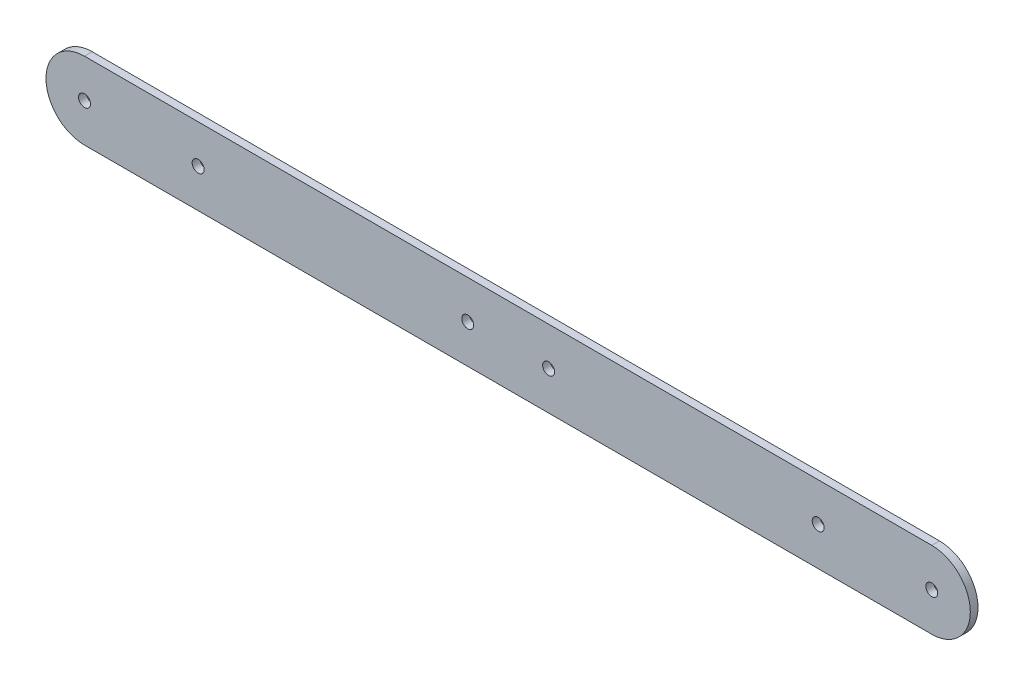
ISO-10303-21;
HEADER;
FILE_DESCRIPTION(('STEP AP214'),'2;1');
FILE_NAME('part.step','',(''),(''),'','','');
FILE_SCHEMA(('AUTOMOTIVE_DESIGN { 1 0 10303 214 1 1 1 1 }'));
ENDSEC;
DATA;
#1=APPLICATION_CONTEXT('core data for automotive mechanical design processes');
#2=APPLICATION_PROTOCOL_DEFINITION('international standard','automotive_design',2000,#1);
#3=PRODUCT_CONTEXT('',#1,'mechanical');
#4=PRODUCT('Part','Part','',(#3));
#5=PRODUCT_RELATED_PRODUCT_CATEGORY('part','',(#4));
#6=PRODUCT_DEFINITION_FORMATION('','',#4);
#7=PRODUCT_DEFINITION_CONTEXT('part definition',#1,'design');
#8=PRODUCT_DEFINITION('design','',#6,#7);
#9=PRODUCT_DEFINITION_SHAPE('','',#8);
#10=(LENGTH_UNIT() NAMED_UNIT(*) SI_UNIT(.MILLI.,.METRE.));
#11=(NAMED_UNIT(*) PLANE_ANGLE_UNIT() SI_UNIT($,.RADIAN.));
#12=(NAMED_UNIT(*) SI_UNIT($,.STERADIAN.) SOLID_ANGLE_UNIT());
#13=UNCERTAINTY_MEASURE_WITH_UNIT(LENGTH_MEASURE(1.E-05),#10,'distance_accuracy_value','');
#14=(GEOMETRIC_REPRESENTATION_CONTEXT(3) GLOBAL_UNCERTAINTY_ASSIGNED_CONTEXT((#13)) GLOBAL_UNIT_ASSIGNED_CONTEXT((#10,
#11,#12)) REPRESENTATION_CONTEXT('',''));
#15=CARTESIAN_POINT('',(0.,0.,0.));
#16=DIRECTION('',(0.,0.,1.));
#17=DIRECTION('',(1.,0.,0.));
#18=AXIS2_PLACEMENT_3D('',#15,#16,#17);
#19=CARTESIAN_POINT('',(-110.,0.,2.));
#20=DIRECTION('',(0.,0.,1.));
#21=DIRECTION('',(1.,0.,0.));
#22=AXIS2_PLACEMENT_3D('',#19,#20,#21);
#23=PLANE('',#22);
#24=CARTESIAN_POINT('',(-110.,0.,2.));
#25=DIRECTION('',(0.,0.,1.));
#26=DIRECTION('',(1.,0.,0.));
#27=AXIS2_PLACEMENT_3D('',#24,#25,#26);
#28=CIRCLE('',#27,1.54999999999999);
#29=CARTESIAN_POINT('',(-108.45,0.,2.));
#30=VERTEX_POINT('',#29);
#31=EDGE_CURVE('E160',#30,#30,#28,.T.);
#32=ORIENTED_EDGE('',*,*,#31,.F.);
#33=EDGE_LOOP('',(#32));
#34=FACE_BOUND('',#33,.T.);
#35=CARTESIAN_POINT('',(-80.5,0.,2.));
#36=DIRECTION('',(0.,0.,1.));
#37=DIRECTION('',(-1.,0.,0.));
#38=AXIS2_PLACEMENT_3D('',#35,#36,#37);
#39=CIRCLE('',#38,1.54999999999999);
#40=CARTESIAN_POINT('',(-82.05,0.,2.));
#41=VERTEX_POINT('',#40);
#42=EDGE_CURVE('E144',#41,#41,#39,.T.);
#43=ORIENTED_EDGE('',*,*,#42,.F.);
#44=EDGE_LOOP('',(#43));
#45=FACE_BOUND('',#44,.T.);
#46=CARTESIAN_POINT('',(10.5,0.,2.));
#47=DIRECTION('',(0.,0.,1.));
#48=DIRECTION('',(1.,0.,0.));
#49=AXIS2_PLACEMENT_3D('',#46,#47,#48);
#50=CIRCLE('',#49,1.55);
#51=CARTESIAN_POINT('',(12.05,0.,2.));
#52=VERTEX_POINT('',#51);
#53=EDGE_CURVE('E114',#52,#52,#50,.T.);
#54=ORIENTED_EDGE('',*,*,#53,.F.);
#55=EDGE_LOOP('',(#54));
#56=FACE_BOUND('',#55,.T.);
#57=CARTESIAN_POINT('',(-110.,0.,2.));
#58=DIRECTION('',(0.,0.,1.));
#59=DIRECTION('',(1.,0.,0.));
#60=AXIS2_PLACEMENT_3D('',#57,#58,#59);
#61=CIRCLE('',#60,10.);
#62=CARTESIAN_POINT('',(-110.,10.,2.));
#63=VERTEX_POINT('',#62);
#64=CARTESIAN_POINT('',(-110.,-10.,2.));
#65=VERTEX_POINT('',#64);
#66=EDGE_CURVE('E94',#63,#65,#61,.T.);
#67=ORIENTED_EDGE('',*,*,#66,.T.);
#68=DIRECTION('',(1.,0.,0.));
#69=VECTOR('',#68,1.);
#70=CARTESIAN_POINT('',(-110.,-10.,2.));
#71=LINE('',#70,#69);
#72=CARTESIAN_POINT('',(110.,-10.,2.));
#73=VERTEX_POINT('',#72);
#74=EDGE_CURVE('E89',#65,#73,#71,.T.);
#75=ORIENTED_EDGE('',*,*,#74,.T.);
#76=CARTESIAN_POINT('',(110.,0.,2.));
#77=DIRECTION('',(0.,0.,1.));
#78=DIRECTION('',(-1.,0.,0.));
#79=AXIS2_PLACEMENT_3D('',#76,#77,#78);
#80=CIRCLE('',#79,10.);
#81=CARTESIAN_POINT('',(110.,10.,2.));
#82=VERTEX_POINT('',#81);
#83=EDGE_CURVE('E92',#73,#82,#80,.T.);
#84=ORIENTED_EDGE('',*,*,#83,.T.);
#85=DIRECTION('',(-1.,0.,0.));
#86=VECTOR('',#85,1.);
#87=CARTESIAN_POINT('',(-110.,10.,2.));
#88=LINE('',#87,#86);
#89=EDGE_CURVE('E59',#82,#63,#88,.T.);
#90=ORIENTED_EDGE('',*,*,#89,.T.);
#91=EDGE_LOOP('',(#67,#75,#84,#90));
#92=FACE_BOUND('',#91,.T.);
#93=CARTESIAN_POINT('',(80.5,0.,2.));
#94=DIRECTION('',(0.,0.,1.));
#95=DIRECTION('',(1.,0.,0.));
#96=AXIS2_PLACEMENT_3D('',#93,#94,#95);
#97=CIRCLE('',#96,1.54999999999999);
#98=CARTESIAN_POINT('',(82.05,0.,2.));
#99=VERTEX_POINT('',#98);
#100=EDGE_CURVE('E136',#99,#99,#97,.T.);
#101=ORIENTED_EDGE('',*,*,#100,.F.);
#102=EDGE_LOOP('',(#101));
#103=FACE_BOUND('',#102,.T.);
#104=CARTESIAN_POINT('',(-10.5,0.,2.));
#105=DIRECTION('',(0.,0.,1.));
#106=DIRECTION('',(-1.,0.,0.));
#107=AXIS2_PLACEMENT_3D('',#104,#105,#106);
#108=CIRCLE('',#107,1.55);
#109=CARTESIAN_POINT('',(-12.05,0.,2.));
#110=VERTEX_POINT('',#109);
#111=EDGE_CURVE('E152',#110,#110,#108,.T.);
#112=ORIENTED_EDGE('',*,*,#111,.F.);
#113=EDGE_LOOP('',(#112));
#114=FACE_BOUND('',#113,.T.);
#115=CARTESIAN_POINT('',(110.,0.,2.));
#116=DIRECTION('',(0.,0.,1.));
#117=DIRECTION('',(-1.,0.,0.));
#118=AXIS2_PLACEMENT_3D('',#115,#116,#117);
#119=CIRCLE('',#118,1.54999999999999);
#120=CARTESIAN_POINT('',(108.45,0.,2.));
#121=VERTEX_POINT('',#120);
#122=EDGE_CURVE('E168',#121,#121,#119,.T.);
#123=ORIENTED_EDGE('',*,*,#122,.F.);
#124=EDGE_LOOP('',(#123));
#125=FACE_BOUND('',#124,.T.);
#126=ADVANCED_FACE('F41',(#34,#45,#56,#92,#103,#114,#125),#23,.T.);
#127=CARTESIAN_POINT('',(-110.,0.,0.));
#128=DIRECTION('',(0.,0.,1.));
#129=DIRECTION('',(1.,0.,0.));
#130=AXIS2_PLACEMENT_3D('',#127,#128,#129);
#131=PLANE('',#130);
#132=CARTESIAN_POINT('',(-110.,0.,0.));
#133=DIRECTION('',(0.,0.,1.));
#134=DIRECTION('',(1.,0.,0.));
#135=AXIS2_PLACEMENT_3D('',#132,#133,#134);
#136=CIRCLE('',#135,10.);
#137=CARTESIAN_POINT('',(-110.,10.,0.));
#138=VERTEX_POINT('',#137);
#139=CARTESIAN_POINT('',(-110.,-10.,0.));
#140=VERTEX_POINT('',#139);
#141=EDGE_CURVE('E110',#138,#140,#136,.T.);
#142=ORIENTED_EDGE('',*,*,#141,.F.);
#143=DIRECTION('',(-1.,0.,0.));
#144=VECTOR('',#143,1.);
#145=CARTESIAN_POINT('',(-110.,10.,0.));
#146=LINE('',#145,#144);
#147=CARTESIAN_POINT('',(110.,10.,0.));
#148=VERTEX_POINT('',#147);
#149=EDGE_CURVE('E82',#148,#138,#146,.T.);
#150=ORIENTED_EDGE('',*,*,#149,.F.);
#151=CARTESIAN_POINT('',(110.,0.,0.));
#152=DIRECTION('',(0.,0.,1.));
#153=DIRECTION('',(-1.,0.,0.));
#154=AXIS2_PLACEMENT_3D('',#151,#152,#153);
#155=CIRCLE('',#154,10.);
#156=CARTESIAN_POINT('',(110.,-10.,0.));
#157=VERTEX_POINT('',#156);
#158=EDGE_CURVE('E76',#157,#148,#155,.T.);
#159=ORIENTED_EDGE('',*,*,#158,.F.);
#160=DIRECTION('',(1.,0.,0.));
#161=VECTOR('',#160,1.);
#162=CARTESIAN_POINT('',(-110.,-10.,0.));
#163=LINE('',#162,#161);
#164=EDGE_CURVE('E99',#140,#157,#163,.T.);
#165=ORIENTED_EDGE('',*,*,#164,.F.);
#166=EDGE_LOOP('',(#142,#150,#159,#165));
#167=FACE_BOUND('',#166,.T.);
#168=CARTESIAN_POINT('',(10.5,0.,0.));
#169=DIRECTION('',(0.,0.,1.));
#170=DIRECTION('',(1.,0.,0.));
#171=AXIS2_PLACEMENT_3D('',#168,#169,#170);
#172=CIRCLE('',#171,1.55);
#173=CARTESIAN_POINT('',(12.05,0.,0.));
#174=VERTEX_POINT('',#173);
#175=EDGE_CURVE('E132',#174,#174,#172,.T.);
#176=ORIENTED_EDGE('',*,*,#175,.T.);
#177=EDGE_LOOP('',(#176));
#178=FACE_BOUND('',#177,.T.);
#179=CARTESIAN_POINT('',(80.5,0.,0.));
#180=DIRECTION('',(0.,0.,1.));
#181=DIRECTION('',(1.,0.,0.));
#182=AXIS2_PLACEMENT_3D('',#179,#180,#181);
#183=CIRCLE('',#182,1.54999999999999);
#184=CARTESIAN_POINT('',(82.05,0.,0.));
#185=VERTEX_POINT('',#184);
#186=EDGE_CURVE('E140',#185,#185,#183,.T.);
#187=ORIENTED_EDGE('',*,*,#186,.T.);
#188=EDGE_LOOP('',(#187));
#189=FACE_BOUND('',#188,.T.);
#190=CARTESIAN_POINT('',(-80.5,0.,0.));
#191=DIRECTION('',(0.,0.,1.));
#192=DIRECTION('',(-1.,0.,0.));
#193=AXIS2_PLACEMENT_3D('',#190,#191,#192);
#194=CIRCLE('',#193,1.54999999999999);
#195=CARTESIAN_POINT('',(-82.05,0.,0.));
#196=VERTEX_POINT('',#195);
#197=EDGE_CURVE('E148',#196,#196,#194,.T.);
#198=ORIENTED_EDGE('',*,*,#197,.T.);
#199=EDGE_LOOP('',(#198));
#200=FACE_BOUND('',#199,.T.);
#201=CARTESIAN_POINT('',(-10.5,0.,0.));
#202=DIRECTION('',(0.,0.,1.));
#203=DIRECTION('',(-1.,0.,0.));
#204=AXIS2_PLACEMENT_3D('',#201,#202,#203);
#205=CIRCLE('',#204,1.55);
#206=CARTESIAN_POINT('',(-12.05,0.,0.));
#207=VERTEX_POINT('',#206);
#208=EDGE_CURVE('E156',#207,#207,#205,.T.);
#209=ORIENTED_EDGE('',*,*,#208,.T.);
#210=EDGE_LOOP('',(#209));
#211=FACE_BOUND('',#210,.T.);
#212=CARTESIAN_POINT('',(-110.,0.,0.));
#213=DIRECTION('',(0.,0.,1.));
#214=DIRECTION('',(1.,0.,0.));
#215=AXIS2_PLACEMENT_3D('',#212,#213,#214);
#216=CIRCLE('',#215,1.54999999999999);
#217=CARTESIAN_POINT('',(-108.45,0.,0.));
#218=VERTEX_POINT('',#217);
#219=EDGE_CURVE('E164',#218,#218,#216,.T.);
#220=ORIENTED_EDGE('',*,*,#219,.T.);
#221=EDGE_LOOP('',(#220));
#222=FACE_BOUND('',#221,.T.);
#223=CARTESIAN_POINT('',(110.,0.,0.));
#224=DIRECTION('',(0.,0.,1.));
#225=DIRECTION('',(-1.,0.,0.));
#226=AXIS2_PLACEMENT_3D('',#223,#224,#225);
#227=CIRCLE('',#226,1.54999999999999);
#228=CARTESIAN_POINT('',(108.45,0.,0.));
#229=VERTEX_POINT('',#228);
#230=EDGE_CURVE('E172',#229,#229,#227,.T.);
#231=ORIENTED_EDGE('',*,*,#230,.T.);
#232=EDGE_LOOP('',(#231));
#233=FACE_BOUND('',#232,.T.);
#234=ADVANCED_FACE('F127',(#167,#178,#189,#200,#211,#222,#233),#131,.F.);
#235=CARTESIAN_POINT('',(-110.,0.,2.));
#236=DIRECTION('',(0.,0.,-1.));
#237=DIRECTION('',(-1.,0.,0.));
#238=AXIS2_PLACEMENT_3D('',#235,#236,#237);
#239=CYLINDRICAL_SURFACE('',#238,10.);
#240=ORIENTED_EDGE('',*,*,#141,.T.);
#241=DIRECTION('',(0.,0.,-1.));
#242=VECTOR('',#241,1.);
#243=CARTESIAN_POINT('',(-110.,-10.,2.));
#244=LINE('',#243,#242);
#245=EDGE_CURVE('E11',#65,#140,#244,.T.);
#246=ORIENTED_EDGE('',*,*,#245,.F.);
#247=ORIENTED_EDGE('',*,*,#66,.F.);
#248=DIRECTION('',(0.,0.,-1.));
#249=VECTOR('',#248,1.);
#250=CARTESIAN_POINT('',(-110.,10.,2.));
#251=LINE('',#250,#249);
#252=EDGE_CURVE('E106',#63,#138,#251,.T.);
#253=ORIENTED_EDGE('',*,*,#252,.T.);
#254=EDGE_LOOP('',(#240,#246,#247,#253));
#255=FACE_BOUND('',#254,.T.);
#256=ADVANCED_FACE('F43',(#255),#239,.T.);
#257=CARTESIAN_POINT('',(-110.,-10.,2.));
#258=DIRECTION('',(0.,1.,0.));
#259=DIRECTION('',(0.,0.,1.));
#260=AXIS2_PLACEMENT_3D('',#257,#258,#259);
#261=PLANE('',#260);
#262=ORIENTED_EDGE('',*,*,#164,.T.);
#263=DIRECTION('',(0.,0.,-1.));
#264=VECTOR('',#263,1.);
#265=CARTESIAN_POINT('',(110.,-10.,2.));
#266=LINE('',#265,#264);
#267=EDGE_CURVE('E51',#73,#157,#266,.T.);
#268=ORIENTED_EDGE('',*,*,#267,.F.);
#269=ORIENTED_EDGE('',*,*,#74,.F.);
#270=ORIENTED_EDGE('',*,*,#245,.T.);
#271=EDGE_LOOP('',(#262,#268,#269,#270));
#272=FACE_BOUND('',#271,.T.);
#273=ADVANCED_FACE('F98',(#272),#261,.F.);
#274=CARTESIAN_POINT('',(110.,0.,2.));
#275=DIRECTION('',(0.,0.,-1.));
#276=DIRECTION('',(-1.,0.,0.));
#277=AXIS2_PLACEMENT_3D('',#274,#275,#276);
#278=CYLINDRICAL_SURFACE('',#277,10.);
#279=ORIENTED_EDGE('',*,*,#158,.T.);
#280=DIRECTION('',(0.,0.,-1.));
#281=VECTOR('',#280,1.);
#282=CARTESIAN_POINT('',(110.,10.,2.));
#283=LINE('',#282,#281);
#284=EDGE_CURVE('E101',#82,#148,#283,.T.);
#285=ORIENTED_EDGE('',*,*,#284,.F.);
#286=ORIENTED_EDGE('',*,*,#83,.F.);
#287=ORIENTED_EDGE('',*,*,#267,.T.);
#288=EDGE_LOOP('',(#279,#285,#286,#287));
#289=FACE_BOUND('',#288,.T.);
#290=ADVANCED_FACE('F102',(#289),#278,.T.);
#291=CARTESIAN_POINT('',(-110.,10.,2.));
#292=DIRECTION('',(0.,-1.,0.));
#293=DIRECTION('',(0.,0.,-1.));
#294=AXIS2_PLACEMENT_3D('',#291,#292,#293);
#295=PLANE('',#294);
#296=ORIENTED_EDGE('',*,*,#149,.T.);
#297=ORIENTED_EDGE('',*,*,#252,.F.);
#298=ORIENTED_EDGE('',*,*,#89,.F.);
#299=ORIENTED_EDGE('',*,*,#284,.T.);
#300=EDGE_LOOP('',(#296,#297,#298,#299));
#301=FACE_BOUND('',#300,.T.);
#302=ADVANCED_FACE('F124',(#301),#295,.F.);
#303=CARTESIAN_POINT('',(10.5,0.,2.));
#304=DIRECTION('',(0.,0.,-1.));
#305=DIRECTION('',(-1.,0.,0.));
#306=AXIS2_PLACEMENT_3D('',#303,#304,#305);
#307=CYLINDRICAL_SURFACE('',#306,1.55);
#308=ORIENTED_EDGE('',*,*,#53,.T.);
#309=EDGE_LOOP('',(#308));
#310=FACE_BOUND('',#309,.T.);
#311=ORIENTED_EDGE('',*,*,#175,.F.);
#312=EDGE_LOOP('',(#311));
#313=FACE_BOUND('',#312,.T.);
#314=ADVANCED_FACE('F193',(#310,#313),#307,.F.);
#315=CARTESIAN_POINT('',(80.5,0.,2.));
#316=DIRECTION('',(0.,0.,-1.));
#317=DIRECTION('',(-1.,0.,0.));
#318=AXIS2_PLACEMENT_3D('',#315,#316,#317);
#319=CYLINDRICAL_SURFACE('',#318,1.54999999999999);
#320=ORIENTED_EDGE('',*,*,#100,.T.);
#321=EDGE_LOOP('',(#320));
#322=FACE_BOUND('',#321,.T.);
#323=ORIENTED_EDGE('',*,*,#186,.F.);
#324=EDGE_LOOP('',(#323));
#325=FACE_BOUND('',#324,.T.);
#326=ADVANCED_FACE('F239',(#322,#325),#319,.F.);
#327=CARTESIAN_POINT('',(-80.5,0.,2.));
#328=DIRECTION('',(0.,0.,-1.));
#329=DIRECTION('',(-1.,0.,0.));
#330=AXIS2_PLACEMENT_3D('',#327,#328,#329);
#331=CYLINDRICAL_SURFACE('',#330,1.54999999999999);
#332=ORIENTED_EDGE('',*,*,#42,.T.);
#333=EDGE_LOOP('',(#332));
#334=FACE_BOUND('',#333,.T.);
#335=ORIENTED_EDGE('',*,*,#197,.F.);
#336=EDGE_LOOP('',(#335));
#337=FACE_BOUND('',#336,.T.);
#338=ADVANCED_FACE('F247',(#334,#337),#331,.F.);
#339=CARTESIAN_POINT('',(-10.5,0.,2.));
#340=DIRECTION('',(0.,0.,-1.));
#341=DIRECTION('',(-1.,0.,0.));
#342=AXIS2_PLACEMENT_3D('',#339,#340,#341);
#343=CYLINDRICAL_SURFACE('',#342,1.55);
#344=ORIENTED_EDGE('',*,*,#111,.T.);
#345=EDGE_LOOP('',(#344));
#346=FACE_BOUND('',#345,.T.);
#347=ORIENTED_EDGE('',*,*,#208,.F.);
#348=EDGE_LOOP('',(#347));
#349=FACE_BOUND('',#348,.T.);
#350=ADVANCED_FACE('F255',(#346,#349),#343,.F.);
#351=CARTESIAN_POINT('',(-110.,0.,2.));
#352=DIRECTION('',(0.,0.,-1.));
#353=DIRECTION('',(-1.,0.,0.));
#354=AXIS2_PLACEMENT_3D('',#351,#352,#353);
#355=CYLINDRICAL_SURFACE('',#354,1.54999999999999);
#356=ORIENTED_EDGE('',*,*,#31,.T.);
#357=EDGE_LOOP('',(#356));
#358=FACE_BOUND('',#357,.T.);
#359=ORIENTED_EDGE('',*,*,#219,.F.);
#360=EDGE_LOOP('',(#359));
#361=FACE_BOUND('',#360,.T.);
#362=ADVANCED_FACE('F264',(#358,#361),#355,.F.);
#363=CARTESIAN_POINT('',(110.,0.,2.));
#364=DIRECTION('',(0.,0.,-1.));
#365=DIRECTION('',(-1.,0.,0.));
#366=AXIS2_PLACEMENT_3D('',#363,#364,#365);
#367=CYLINDRICAL_SURFACE('',#366,1.54999999999999);
#368=ORIENTED_EDGE('',*,*,#122,.T.);
#369=EDGE_LOOP('',(#368));
#370=FACE_BOUND('',#369,.T.);
#371=ORIENTED_EDGE('',*,*,#230,.F.);
#372=EDGE_LOOP('',(#371));
#373=FACE_BOUND('',#372,.T.);
#374=ADVANCED_FACE('F180',(#370,#373),#367,.F.);
#375=CLOSED_SHELL('',(#126,#234,#256,#273,#290,#302,#314,#326,#338,#350,#362,#374));
#376=MANIFOLD_SOLID_BREP('B2',#375);
#377=ADVANCED_BREP_SHAPE_REPRESENTATION('',(#18,#376),#14);
#378=SHAPE_DEFINITION_REPRESENTATION(#9,#377);
ENDSEC;
END-ISO-10303-21;
